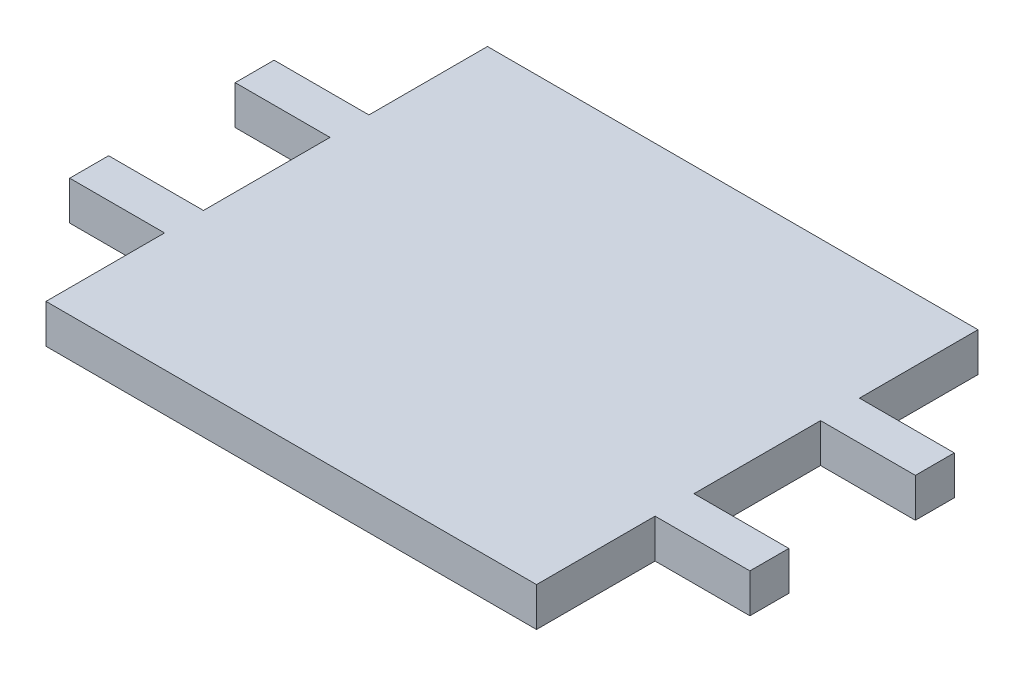
ISO-10303-21;
HEADER;
FILE_DESCRIPTION(('STEP AP214'),'2;1');
FILE_NAME('part.step','',(''),(''),'','','');
FILE_SCHEMA(('AUTOMOTIVE_DESIGN { 1 0 10303 214 1 1 1 1 }'));
ENDSEC;
DATA;
#1=APPLICATION_CONTEXT('core data for automotive mechanical design processes');
#2=APPLICATION_PROTOCOL_DEFINITION('international standard','automotive_design',2000,#1);
#3=PRODUCT_CONTEXT('',#1,'mechanical');
#4=PRODUCT('Part','Part','',(#3));
#5=PRODUCT_RELATED_PRODUCT_CATEGORY('part','',(#4));
#6=PRODUCT_DEFINITION_FORMATION('','',#4);
#7=PRODUCT_DEFINITION_CONTEXT('part definition',#1,'design');
#8=PRODUCT_DEFINITION('design','',#6,#7);
#9=PRODUCT_DEFINITION_SHAPE('','',#8);
#10=(LENGTH_UNIT() NAMED_UNIT(*) SI_UNIT(.MILLI.,.METRE.));
#11=(NAMED_UNIT(*) PLANE_ANGLE_UNIT() SI_UNIT($,.RADIAN.));
#12=(NAMED_UNIT(*) SI_UNIT($,.STERADIAN.) SOLID_ANGLE_UNIT());
#13=UNCERTAINTY_MEASURE_WITH_UNIT(LENGTH_MEASURE(1.E-05),#10,'distance_accuracy_value','');
#14=(GEOMETRIC_REPRESENTATION_CONTEXT(3) GLOBAL_UNCERTAINTY_ASSIGNED_CONTEXT((#13)) GLOBAL_UNIT_ASSIGNED_CONTEXT((#10,
#11,#12)) REPRESENTATION_CONTEXT('',''));
#15=CARTESIAN_POINT('',(0.,0.,0.));
#16=DIRECTION('',(0.,0.,1.));
#17=DIRECTION('',(1.,0.,0.));
#18=AXIS2_PLACEMENT_3D('',#15,#16,#17);
#19=CARTESIAN_POINT('',(38.1,6.0452,0.));
#20=DIRECTION('',(1.,0.,0.));
#21=DIRECTION('',(0.,0.,-1.));
#22=AXIS2_PLACEMENT_3D('',#19,#20,#21);
#23=PLANE('',#22);
#24=DIRECTION('',(0.,0.,1.));
#25=VECTOR('',#24,1.);
#26=CARTESIAN_POINT('',(38.1,0.,0.));
#27=LINE('',#26,#25);
#28=CARTESIAN_POINT('',(38.1,0.,-34.29));
#29=VERTEX_POINT('',#28);
#30=CARTESIAN_POINT('',(38.1,0.,-15.875));
#31=VERTEX_POINT('',#30);
#32=EDGE_CURVE('E219',#29,#31,#27,.T.);
#33=ORIENTED_EDGE('',*,*,#32,.F.);
#34=DIRECTION('',(0.,-1.,0.));
#35=VECTOR('',#34,1.);
#36=CARTESIAN_POINT('',(38.1,6.0452,-34.29));
#37=LINE('',#36,#35);
#38=CARTESIAN_POINT('',(38.1,6.0452,-34.29));
#39=VERTEX_POINT('',#38);
#40=EDGE_CURVE('E11',#39,#29,#37,.T.);
#41=ORIENTED_EDGE('',*,*,#40,.F.);
#42=DIRECTION('',(0.,0.,1.));
#43=VECTOR('',#42,1.);
#44=CARTESIAN_POINT('',(38.1,6.0452,0.));
#45=LINE('',#44,#43);
#46=CARTESIAN_POINT('',(38.1,6.0452,-15.875));
#47=VERTEX_POINT('',#46);
#48=EDGE_CURVE('E279',#39,#47,#45,.T.);
#49=ORIENTED_EDGE('',*,*,#48,.T.);
#50=DIRECTION('',(0.,-1.,0.));
#51=VECTOR('',#50,1.);
#52=CARTESIAN_POINT('',(38.1,6.0452,-15.875));
#53=LINE('',#52,#51);
#54=EDGE_CURVE('E137',#47,#31,#53,.T.);
#55=ORIENTED_EDGE('',*,*,#54,.T.);
#56=EDGE_LOOP('',(#33,#41,#49,#55));
#57=FACE_BOUND('',#56,.T.);
#58=ADVANCED_FACE('F49',(#57),#23,.T.);
#59=CARTESIAN_POINT('',(0.,6.0452,-34.29));
#60=DIRECTION('',(0.,0.,-1.));
#61=DIRECTION('',(-1.,0.,0.));
#62=AXIS2_PLACEMENT_3D('',#59,#60,#61);
#63=PLANE('',#62);
#64=DIRECTION('',(1.,0.,0.));
#65=VECTOR('',#64,1.);
#66=CARTESIAN_POINT('',(0.,0.,-34.29));
#67=LINE('',#66,#65);
#68=CARTESIAN_POINT('',(-38.1,0.,-34.29));
#69=VERTEX_POINT('',#68);
#70=EDGE_CURVE('E223',#69,#29,#67,.T.);
#71=ORIENTED_EDGE('',*,*,#70,.F.);
#72=DIRECTION('',(0.,-1.,0.));
#73=VECTOR('',#72,1.);
#74=CARTESIAN_POINT('',(-38.1,6.0452,-34.29));
#75=LINE('',#74,#73);
#76=CARTESIAN_POINT('',(-38.1,6.0452,-34.29));
#77=VERTEX_POINT('',#76);
#78=EDGE_CURVE('E59',#77,#69,#75,.T.);
#79=ORIENTED_EDGE('',*,*,#78,.F.);
#80=DIRECTION('',(1.,0.,0.));
#81=VECTOR('',#80,1.);
#82=CARTESIAN_POINT('',(0.,6.0452,-34.29));
#83=LINE('',#82,#81);
#84=EDGE_CURVE('E347',#77,#39,#83,.T.);
#85=ORIENTED_EDGE('',*,*,#84,.T.);
#86=ORIENTED_EDGE('',*,*,#40,.T.);
#87=EDGE_LOOP('',(#71,#79,#85,#86));
#88=FACE_BOUND('',#87,.T.);
#89=ADVANCED_FACE('F51',(#88),#63,.T.);
#90=CARTESIAN_POINT('',(-38.1,6.0452,0.));
#91=DIRECTION('',(1.,0.,0.));
#92=DIRECTION('',(0.,0.,-1.));
#93=AXIS2_PLACEMENT_3D('',#90,#91,#92);
#94=PLANE('',#93);
#95=DIRECTION('',(0.,0.,1.));
#96=VECTOR('',#95,1.);
#97=CARTESIAN_POINT('',(-38.1,0.,0.));
#98=LINE('',#97,#96);
#99=CARTESIAN_POINT('',(-38.1,0.,-15.875));
#100=VERTEX_POINT('',#99);
#101=EDGE_CURVE('E229',#69,#100,#98,.T.);
#102=ORIENTED_EDGE('',*,*,#101,.T.);
#103=DIRECTION('',(0.,-1.,0.));
#104=VECTOR('',#103,1.);
#105=CARTESIAN_POINT('',(-38.1,6.0452,-15.875));
#106=LINE('',#105,#104);
#107=CARTESIAN_POINT('',(-38.1,6.0452,-15.875));
#108=VERTEX_POINT('',#107);
#109=EDGE_CURVE('E330',#108,#100,#106,.T.);
#110=ORIENTED_EDGE('',*,*,#109,.F.);
#111=DIRECTION('',(0.,0.,1.));
#112=VECTOR('',#111,1.);
#113=CARTESIAN_POINT('',(-38.1,6.0452,0.));
#114=LINE('',#113,#112);
#115=EDGE_CURVE('E338',#77,#108,#114,.T.);
#116=ORIENTED_EDGE('',*,*,#115,.F.);
#117=ORIENTED_EDGE('',*,*,#78,.T.);
#118=EDGE_LOOP('',(#102,#110,#116,#117));
#119=FACE_BOUND('',#118,.T.);
#120=ADVANCED_FACE('F336',(#119),#94,.F.);
#121=CARTESIAN_POINT('',(0.,6.0452,-15.875));
#122=DIRECTION('',(0.,0.,-1.));
#123=DIRECTION('',(-1.,0.,0.));
#124=AXIS2_PLACEMENT_3D('',#121,#122,#123);
#125=PLANE('',#124);
#126=DIRECTION('',(1.,0.,0.));
#127=VECTOR('',#126,1.);
#128=CARTESIAN_POINT('',(0.,0.,-15.875));
#129=LINE('',#128,#127);
#130=CARTESIAN_POINT('',(-52.832,0.,-15.875));
#131=VERTEX_POINT('',#130);
#132=EDGE_CURVE('E233',#131,#100,#129,.T.);
#133=ORIENTED_EDGE('',*,*,#132,.F.);
#134=DIRECTION('',(0.,-1.,0.));
#135=VECTOR('',#134,1.);
#136=CARTESIAN_POINT('',(-52.832,6.0452,-15.875));
#137=LINE('',#136,#135);
#138=CARTESIAN_POINT('',(-52.832,6.0452,-15.875));
#139=VERTEX_POINT('',#138);
#140=EDGE_CURVE('E327',#139,#131,#137,.T.);
#141=ORIENTED_EDGE('',*,*,#140,.F.);
#142=DIRECTION('',(1.,0.,0.));
#143=VECTOR('',#142,1.);
#144=CARTESIAN_POINT('',(0.,6.0452,-15.875));
#145=LINE('',#144,#143);
#146=EDGE_CURVE('E438',#139,#108,#145,.T.);
#147=ORIENTED_EDGE('',*,*,#146,.T.);
#148=ORIENTED_EDGE('',*,*,#109,.T.);
#149=EDGE_LOOP('',(#133,#141,#147,#148));
#150=FACE_BOUND('',#149,.T.);
#151=ADVANCED_FACE('F444',(#150),#125,.T.);
#152=CARTESIAN_POINT('',(-52.832,6.0452,0.));
#153=DIRECTION('',(1.,0.,0.));
#154=DIRECTION('',(0.,0.,-1.));
#155=AXIS2_PLACEMENT_3D('',#152,#153,#154);
#156=PLANE('',#155);
#157=DIRECTION('',(0.,0.,1.));
#158=VECTOR('',#157,1.);
#159=CARTESIAN_POINT('',(-52.832,0.,0.));
#160=LINE('',#159,#158);
#161=CARTESIAN_POINT('',(-52.832,0.,-9.8298));
#162=VERTEX_POINT('',#161);
#163=EDGE_CURVE('E239',#131,#162,#160,.T.);
#164=ORIENTED_EDGE('',*,*,#163,.T.);
#165=DIRECTION('',(0.,-1.,0.));
#166=VECTOR('',#165,1.);
#167=CARTESIAN_POINT('',(-52.832,6.0452,-9.8298));
#168=LINE('',#167,#166);
#169=CARTESIAN_POINT('',(-52.832,6.0452,-9.8298));
#170=VERTEX_POINT('',#169);
#171=EDGE_CURVE('E323',#170,#162,#168,.T.);
#172=ORIENTED_EDGE('',*,*,#171,.F.);
#173=DIRECTION('',(0.,0.,1.));
#174=VECTOR('',#173,1.);
#175=CARTESIAN_POINT('',(-52.832,6.0452,0.));
#176=LINE('',#175,#174);
#177=EDGE_CURVE('E435',#139,#170,#176,.T.);
#178=ORIENTED_EDGE('',*,*,#177,.F.);
#179=ORIENTED_EDGE('',*,*,#140,.T.);
#180=EDGE_LOOP('',(#164,#172,#178,#179));
#181=FACE_BOUND('',#180,.T.);
#182=ADVANCED_FACE('F448',(#181),#156,.F.);
#183=CARTESIAN_POINT('',(0.,6.0452,-9.8298));
#184=DIRECTION('',(0.,0.,-1.));
#185=DIRECTION('',(-1.,0.,0.));
#186=AXIS2_PLACEMENT_3D('',#183,#184,#185);
#187=PLANE('',#186);
#188=DIRECTION('',(1.,0.,0.));
#189=VECTOR('',#188,1.);
#190=CARTESIAN_POINT('',(0.,0.,-9.8298));
#191=LINE('',#190,#189);
#192=CARTESIAN_POINT('',(-38.1,0.,-9.8298));
#193=VERTEX_POINT('',#192);
#194=EDGE_CURVE('E242',#162,#193,#191,.T.);
#195=ORIENTED_EDGE('',*,*,#194,.T.);
#196=DIRECTION('',(0.,-1.,0.));
#197=VECTOR('',#196,1.);
#198=CARTESIAN_POINT('',(-38.1,6.0452,-9.8298));
#199=LINE('',#198,#197);
#200=CARTESIAN_POINT('',(-38.1,6.0452,-9.8298));
#201=VERTEX_POINT('',#200);
#202=EDGE_CURVE('E319',#201,#193,#199,.T.);
#203=ORIENTED_EDGE('',*,*,#202,.F.);
#204=DIRECTION('',(1.,0.,0.));
#205=VECTOR('',#204,1.);
#206=CARTESIAN_POINT('',(0.,6.0452,-9.8298));
#207=LINE('',#206,#205);
#208=EDGE_CURVE('E431',#170,#201,#207,.T.);
#209=ORIENTED_EDGE('',*,*,#208,.F.);
#210=ORIENTED_EDGE('',*,*,#171,.T.);
#211=EDGE_LOOP('',(#195,#203,#209,#210));
#212=FACE_BOUND('',#211,.T.);
#213=ADVANCED_FACE('F451',(#212),#187,.F.);
#214=CARTESIAN_POINT('',(-38.1,0.,9.8298));
#215=VERTEX_POINT('',#214);
#216=EDGE_CURVE('E235',#193,#215,#98,.T.);
#217=ORIENTED_EDGE('',*,*,#216,.T.);
#218=DIRECTION('',(0.,-1.,0.));
#219=VECTOR('',#218,1.);
#220=CARTESIAN_POINT('',(-38.1,6.0452,9.8298));
#221=LINE('',#220,#219);
#222=CARTESIAN_POINT('',(-38.1,6.0452,9.8298));
#223=VERTEX_POINT('',#222);
#224=EDGE_CURVE('E316',#223,#215,#221,.T.);
#225=ORIENTED_EDGE('',*,*,#224,.F.);
#226=EDGE_CURVE('E374',#201,#223,#114,.T.);
#227=ORIENTED_EDGE('',*,*,#226,.F.);
#228=ORIENTED_EDGE('',*,*,#202,.T.);
#229=EDGE_LOOP('',(#217,#225,#227,#228));
#230=FACE_BOUND('',#229,.T.);
#231=ADVANCED_FACE('F414',(#230),#94,.F.);
#232=CARTESIAN_POINT('',(0.,6.0452,9.8298));
#233=DIRECTION('',(0.,0.,-1.));
#234=DIRECTION('',(-1.,0.,0.));
#235=AXIS2_PLACEMENT_3D('',#232,#233,#234);
#236=PLANE('',#235);
#237=DIRECTION('',(1.,0.,0.));
#238=VECTOR('',#237,1.);
#239=CARTESIAN_POINT('',(0.,0.,9.8298));
#240=LINE('',#239,#238);
#241=CARTESIAN_POINT('',(-52.832,0.,9.8298));
#242=VERTEX_POINT('',#241);
#243=EDGE_CURVE('E245',#242,#215,#240,.T.);
#244=ORIENTED_EDGE('',*,*,#243,.F.);
#245=DIRECTION('',(0.,-1.,0.));
#246=VECTOR('',#245,1.);
#247=CARTESIAN_POINT('',(-52.832,6.0452,9.8298));
#248=LINE('',#247,#246);
#249=CARTESIAN_POINT('',(-52.832,6.0452,9.8298));
#250=VERTEX_POINT('',#249);
#251=EDGE_CURVE('E313',#250,#242,#248,.T.);
#252=ORIENTED_EDGE('',*,*,#251,.F.);
#253=DIRECTION('',(1.,0.,0.));
#254=VECTOR('',#253,1.);
#255=CARTESIAN_POINT('',(0.,6.0452,9.8298));
#256=LINE('',#255,#254);
#257=EDGE_CURVE('E425',#250,#223,#256,.T.);
#258=ORIENTED_EDGE('',*,*,#257,.T.);
#259=ORIENTED_EDGE('',*,*,#224,.T.);
#260=EDGE_LOOP('',(#244,#252,#258,#259));
#261=FACE_BOUND('',#260,.T.);
#262=ADVANCED_FACE('F422',(#261),#236,.T.);
#263=CARTESIAN_POINT('',(-52.832,6.0452,0.));
#264=DIRECTION('',(1.,0.,0.));
#265=DIRECTION('',(0.,0.,-1.));
#266=AXIS2_PLACEMENT_3D('',#263,#264,#265);
#267=PLANE('',#266);
#268=DIRECTION('',(0.,0.,1.));
#269=VECTOR('',#268,1.);
#270=CARTESIAN_POINT('',(-52.832,0.,0.));
#271=LINE('',#270,#269);
#272=CARTESIAN_POINT('',(-52.832,0.,15.875));
#273=VERTEX_POINT('',#272);
#274=EDGE_CURVE('E249',#242,#273,#271,.T.);
#275=ORIENTED_EDGE('',*,*,#274,.T.);
#276=DIRECTION('',(0.,-1.,0.));
#277=VECTOR('',#276,1.);
#278=CARTESIAN_POINT('',(-52.832,6.0452,15.875));
#279=LINE('',#278,#277);
#280=CARTESIAN_POINT('',(-52.832,6.0452,15.875));
#281=VERTEX_POINT('',#280);
#282=EDGE_CURVE('E309',#281,#273,#279,.T.);
#283=ORIENTED_EDGE('',*,*,#282,.F.);
#284=DIRECTION('',(0.,0.,1.));
#285=VECTOR('',#284,1.);
#286=CARTESIAN_POINT('',(-52.832,6.0452,0.));
#287=LINE('',#286,#285);
#288=EDGE_CURVE('E427',#250,#281,#287,.T.);
#289=ORIENTED_EDGE('',*,*,#288,.F.);
#290=ORIENTED_EDGE('',*,*,#251,.T.);
#291=EDGE_LOOP('',(#275,#283,#289,#290));
#292=FACE_BOUND('',#291,.T.);
#293=ADVANCED_FACE('F491',(#292),#267,.F.);
#294=CARTESIAN_POINT('',(0.,6.0452,15.875));
#295=DIRECTION('',(0.,0.,-1.));
#296=DIRECTION('',(-1.,0.,0.));
#297=AXIS2_PLACEMENT_3D('',#294,#295,#296);
#298=PLANE('',#297);
#299=DIRECTION('',(1.,0.,0.));
#300=VECTOR('',#299,1.);
#301=CARTESIAN_POINT('',(0.,0.,15.875));
#302=LINE('',#301,#300);
#303=CARTESIAN_POINT('',(-38.1,0.,15.875));
#304=VERTEX_POINT('',#303);
#305=EDGE_CURVE('E252',#273,#304,#302,.T.);
#306=ORIENTED_EDGE('',*,*,#305,.T.);
#307=DIRECTION('',(0.,-1.,0.));
#308=VECTOR('',#307,1.);
#309=CARTESIAN_POINT('',(-38.1,6.0452,15.875));
#310=LINE('',#309,#308);
#311=CARTESIAN_POINT('',(-38.1,6.0452,15.875));
#312=VERTEX_POINT('',#311);
#313=EDGE_CURVE('E305',#312,#304,#310,.T.);
#314=ORIENTED_EDGE('',*,*,#313,.F.);
#315=DIRECTION('',(1.,0.,0.));
#316=VECTOR('',#315,1.);
#317=CARTESIAN_POINT('',(0.,6.0452,15.875));
#318=LINE('',#317,#316);
#319=EDGE_CURVE('E372',#281,#312,#318,.T.);
#320=ORIENTED_EDGE('',*,*,#319,.F.);
#321=ORIENTED_EDGE('',*,*,#282,.T.);
#322=EDGE_LOOP('',(#306,#314,#320,#321));
#323=FACE_BOUND('',#322,.T.);
#324=ADVANCED_FACE('F488',(#323),#298,.F.);
#325=CARTESIAN_POINT('',(-38.1,0.,34.29));
#326=VERTEX_POINT('',#325);
#327=EDGE_CURVE('E234',#304,#326,#98,.T.);
#328=ORIENTED_EDGE('',*,*,#327,.T.);
#329=DIRECTION('',(0.,-1.,0.));
#330=VECTOR('',#329,1.);
#331=CARTESIAN_POINT('',(-38.1,6.0452,34.29));
#332=LINE('',#331,#330);
#333=CARTESIAN_POINT('',(-38.1,6.0452,34.29));
#334=VERTEX_POINT('',#333);
#335=EDGE_CURVE('E301',#334,#326,#332,.T.);
#336=ORIENTED_EDGE('',*,*,#335,.F.);
#337=EDGE_CURVE('E367',#312,#334,#114,.T.);
#338=ORIENTED_EDGE('',*,*,#337,.F.);
#339=ORIENTED_EDGE('',*,*,#313,.T.);
#340=EDGE_LOOP('',(#328,#336,#338,#339));
#341=FACE_BOUND('',#340,.T.);
#342=ADVANCED_FACE('F405',(#341),#94,.F.);
#343=CARTESIAN_POINT('',(0.,6.0452,34.29));
#344=DIRECTION('',(0.,0.,-1.));
#345=DIRECTION('',(-1.,0.,0.));
#346=AXIS2_PLACEMENT_3D('',#343,#344,#345);
#347=PLANE('',#346);
#348=DIRECTION('',(1.,0.,0.));
#349=VECTOR('',#348,1.);
#350=CARTESIAN_POINT('',(0.,0.,34.29));
#351=LINE('',#350,#349);
#352=CARTESIAN_POINT('',(38.1,0.,34.29));
#353=VERTEX_POINT('',#352);
#354=EDGE_CURVE('E255',#326,#353,#351,.T.);
#355=ORIENTED_EDGE('',*,*,#354,.T.);
#356=DIRECTION('',(0.,-1.,0.));
#357=VECTOR('',#356,1.);
#358=CARTESIAN_POINT('',(38.1,6.0452,34.29));
#359=LINE('',#358,#357);
#360=CARTESIAN_POINT('',(38.1,6.0452,34.29));
#361=VERTEX_POINT('',#360);
#362=EDGE_CURVE('E298',#361,#353,#359,.T.);
#363=ORIENTED_EDGE('',*,*,#362,.F.);
#364=DIRECTION('',(1.,0.,0.));
#365=VECTOR('',#364,1.);
#366=CARTESIAN_POINT('',(0.,6.0452,34.29));
#367=LINE('',#366,#365);
#368=EDGE_CURVE('E359',#334,#361,#367,.T.);
#369=ORIENTED_EDGE('',*,*,#368,.F.);
#370=ORIENTED_EDGE('',*,*,#335,.T.);
#371=EDGE_LOOP('',(#355,#363,#369,#370));
#372=FACE_BOUND('',#371,.T.);
#373=ADVANCED_FACE('F401',(#372),#347,.F.);
#374=CARTESIAN_POINT('',(38.1,0.,15.875));
#375=VERTEX_POINT('',#374);
#376=EDGE_CURVE('E225',#375,#353,#27,.T.);
#377=ORIENTED_EDGE('',*,*,#376,.F.);
#378=DIRECTION('',(0.,-1.,0.));
#379=VECTOR('',#378,1.);
#380=CARTESIAN_POINT('',(38.1,6.0452,15.875));
#381=LINE('',#380,#379);
#382=CARTESIAN_POINT('',(38.1,6.0452,15.875));
#383=VERTEX_POINT('',#382);
#384=EDGE_CURVE('E295',#383,#375,#381,.T.);
#385=ORIENTED_EDGE('',*,*,#384,.F.);
#386=EDGE_CURVE('E351',#383,#361,#45,.T.);
#387=ORIENTED_EDGE('',*,*,#386,.T.);
#388=ORIENTED_EDGE('',*,*,#362,.T.);
#389=EDGE_LOOP('',(#377,#385,#387,#388));
#390=FACE_BOUND('',#389,.T.);
#391=ADVANCED_FACE('F399',(#390),#23,.T.);
#392=CARTESIAN_POINT('',(0.,6.0452,15.875));
#393=DIRECTION('',(0.,0.,1.));
#394=DIRECTION('',(1.,0.,0.));
#395=AXIS2_PLACEMENT_3D('',#392,#393,#394);
#396=PLANE('',#395);
#397=DIRECTION('',(-1.,0.,0.));
#398=VECTOR('',#397,1.);
#399=CARTESIAN_POINT('',(0.,0.,15.875));
#400=LINE('',#399,#398);
#401=CARTESIAN_POINT('',(52.832,0.,15.875));
#402=VERTEX_POINT('',#401);
#403=EDGE_CURVE('E259',#402,#375,#400,.T.);
#404=ORIENTED_EDGE('',*,*,#403,.F.);
#405=DIRECTION('',(0.,-1.,0.));
#406=VECTOR('',#405,1.);
#407=CARTESIAN_POINT('',(52.832,6.0452,15.875));
#408=LINE('',#407,#406);
#409=CARTESIAN_POINT('',(52.832,6.0452,15.875));
#410=VERTEX_POINT('',#409);
#411=EDGE_CURVE('E292',#410,#402,#408,.T.);
#412=ORIENTED_EDGE('',*,*,#411,.F.);
#413=DIRECTION('',(-1.,0.,0.));
#414=VECTOR('',#413,1.);
#415=CARTESIAN_POINT('',(0.,6.0452,15.875));
#416=LINE('',#415,#414);
#417=EDGE_CURVE('E358',#410,#383,#416,.T.);
#418=ORIENTED_EDGE('',*,*,#417,.T.);
#419=ORIENTED_EDGE('',*,*,#384,.T.);
#420=EDGE_LOOP('',(#404,#412,#418,#419));
#421=FACE_BOUND('',#420,.T.);
#422=ADVANCED_FACE('F469',(#421),#396,.T.);
#423=CARTESIAN_POINT('',(52.832,6.0452,0.));
#424=DIRECTION('',(1.,0.,0.));
#425=DIRECTION('',(0.,0.,-1.));
#426=AXIS2_PLACEMENT_3D('',#423,#424,#425);
#427=PLANE('',#426);
#428=DIRECTION('',(0.,0.,1.));
#429=VECTOR('',#428,1.);
#430=CARTESIAN_POINT('',(52.832,0.,0.));
#431=LINE('',#430,#429);
#432=CARTESIAN_POINT('',(52.832,0.,9.82979999999999));
#433=VERTEX_POINT('',#432);
#434=EDGE_CURVE('E263',#433,#402,#431,.T.);
#435=ORIENTED_EDGE('',*,*,#434,.F.);
#436=DIRECTION('',(0.,-1.,0.));
#437=VECTOR('',#436,1.);
#438=CARTESIAN_POINT('',(52.832,6.0452,9.82979999999999));
#439=LINE('',#438,#437);
#440=CARTESIAN_POINT('',(52.832,6.0452,9.82979999999999));
#441=VERTEX_POINT('',#440);
#442=EDGE_CURVE('E289',#441,#433,#439,.T.);
#443=ORIENTED_EDGE('',*,*,#442,.F.);
#444=DIRECTION('',(0.,0.,1.));
#445=VECTOR('',#444,1.);
#446=CARTESIAN_POINT('',(52.832,6.0452,0.));
#447=LINE('',#446,#445);
#448=EDGE_CURVE('E365',#441,#410,#447,.T.);
#449=ORIENTED_EDGE('',*,*,#448,.T.);
#450=ORIENTED_EDGE('',*,*,#411,.T.);
#451=EDGE_LOOP('',(#435,#443,#449,#450));
#452=FACE_BOUND('',#451,.T.);
#453=ADVANCED_FACE('F475',(#452),#427,.T.);
#454=CARTESIAN_POINT('',(0.,6.0452,9.8298));
#455=DIRECTION('',(0.,0.,1.));
#456=DIRECTION('',(1.,0.,0.));
#457=AXIS2_PLACEMENT_3D('',#454,#455,#456);
#458=PLANE('',#457);
#459=DIRECTION('',(-1.,0.,0.));
#460=VECTOR('',#459,1.);
#461=CARTESIAN_POINT('',(0.,0.,9.8298));
#462=LINE('',#461,#460);
#463=CARTESIAN_POINT('',(38.1,0.,9.82979999999999));
#464=VERTEX_POINT('',#463);
#465=EDGE_CURVE('E267',#433,#464,#462,.T.);
#466=ORIENTED_EDGE('',*,*,#465,.T.);
#467=DIRECTION('',(0.,-1.,0.));
#468=VECTOR('',#467,1.);
#469=CARTESIAN_POINT('',(38.1,6.0452,9.82979999999999));
#470=LINE('',#469,#468);
#471=CARTESIAN_POINT('',(38.1,6.0452,9.82979999999999));
#472=VERTEX_POINT('',#471);
#473=EDGE_CURVE('E286',#472,#464,#470,.T.);
#474=ORIENTED_EDGE('',*,*,#473,.F.);
#475=DIRECTION('',(-1.,0.,0.));
#476=VECTOR('',#475,1.);
#477=CARTESIAN_POINT('',(0.,6.0452,9.8298));
#478=LINE('',#477,#476);
#479=EDGE_CURVE('E355',#441,#472,#478,.T.);
#480=ORIENTED_EDGE('',*,*,#479,.F.);
#481=ORIENTED_EDGE('',*,*,#442,.T.);
#482=EDGE_LOOP('',(#466,#474,#480,#481));
#483=FACE_BOUND('',#482,.T.);
#484=ADVANCED_FACE('F386',(#483),#458,.F.);
#485=CARTESIAN_POINT('',(38.1,0.,-9.82980000000001));
#486=VERTEX_POINT('',#485);
#487=EDGE_CURVE('E224',#486,#464,#27,.T.);
#488=ORIENTED_EDGE('',*,*,#487,.F.);
#489=DIRECTION('',(0.,-1.,0.));
#490=VECTOR('',#489,1.);
#491=CARTESIAN_POINT('',(38.1,6.0452,-9.82980000000001));
#492=LINE('',#491,#490);
#493=CARTESIAN_POINT('',(38.1,6.0452,-9.82980000000001));
#494=VERTEX_POINT('',#493);
#495=EDGE_CURVE('E203',#494,#486,#492,.T.);
#496=ORIENTED_EDGE('',*,*,#495,.F.);
#497=EDGE_CURVE('E209',#494,#472,#45,.T.);
#498=ORIENTED_EDGE('',*,*,#497,.T.);
#499=ORIENTED_EDGE('',*,*,#473,.T.);
#500=EDGE_LOOP('',(#488,#496,#498,#499));
#501=FACE_BOUND('',#500,.T.);
#502=ADVANCED_FACE('F391',(#501),#23,.T.);
#503=CARTESIAN_POINT('',(0.,6.0452,-9.8298));
#504=DIRECTION('',(0.,0.,1.));
#505=DIRECTION('',(1.,0.,0.));
#506=AXIS2_PLACEMENT_3D('',#503,#504,#505);
#507=PLANE('',#506);
#508=DIRECTION('',(-1.,0.,0.));
#509=VECTOR('',#508,1.);
#510=CARTESIAN_POINT('',(0.,0.,-9.8298));
#511=LINE('',#510,#509);
#512=CARTESIAN_POINT('',(52.832,0.,-9.82980000000001));
#513=VERTEX_POINT('',#512);
#514=EDGE_CURVE('E197',#513,#486,#511,.T.);
#515=ORIENTED_EDGE('',*,*,#514,.F.);
#516=DIRECTION('',(0.,-1.,0.));
#517=VECTOR('',#516,1.);
#518=CARTESIAN_POINT('',(52.832,6.0452,-9.82980000000001));
#519=LINE('',#518,#517);
#520=CARTESIAN_POINT('',(52.832,6.0452,-9.82980000000001));
#521=VERTEX_POINT('',#520);
#522=EDGE_CURVE('E192',#521,#513,#519,.T.);
#523=ORIENTED_EDGE('',*,*,#522,.F.);
#524=DIRECTION('',(-1.,0.,0.));
#525=VECTOR('',#524,1.);
#526=CARTESIAN_POINT('',(0.,6.0452,-9.8298));
#527=LINE('',#526,#525);
#528=EDGE_CURVE('E195',#521,#494,#527,.T.);
#529=ORIENTED_EDGE('',*,*,#528,.T.);
#530=ORIENTED_EDGE('',*,*,#495,.T.);
#531=EDGE_LOOP('',(#515,#523,#529,#530));
#532=FACE_BOUND('',#531,.T.);
#533=ADVANCED_FACE('F194',(#532),#507,.T.);
#534=CARTESIAN_POINT('',(52.832,6.0452,0.));
#535=DIRECTION('',(1.,0.,0.));
#536=DIRECTION('',(0.,0.,-1.));
#537=AXIS2_PLACEMENT_3D('',#534,#535,#536);
#538=PLANE('',#537);
#539=DIRECTION('',(0.,0.,1.));
#540=VECTOR('',#539,1.);
#541=CARTESIAN_POINT('',(52.832,0.,0.));
#542=LINE('',#541,#540);
#543=CARTESIAN_POINT('',(52.832,0.,-15.875));
#544=VERTEX_POINT('',#543);
#545=EDGE_CURVE('E273',#544,#513,#542,.T.);
#546=ORIENTED_EDGE('',*,*,#545,.F.);
#547=DIRECTION('',(0.,-1.,0.));
#548=VECTOR('',#547,1.);
#549=CARTESIAN_POINT('',(52.832,6.0452,-15.875));
#550=LINE('',#549,#548);
#551=CARTESIAN_POINT('',(52.832,6.0452,-15.875));
#552=VERTEX_POINT('',#551);
#553=EDGE_CURVE('E130',#552,#544,#550,.T.);
#554=ORIENTED_EDGE('',*,*,#553,.F.);
#555=DIRECTION('',(0.,0.,1.));
#556=VECTOR('',#555,1.);
#557=CARTESIAN_POINT('',(52.832,6.0452,0.));
#558=LINE('',#557,#556);
#559=EDGE_CURVE('E207',#552,#521,#558,.T.);
#560=ORIENTED_EDGE('',*,*,#559,.T.);
#561=ORIENTED_EDGE('',*,*,#522,.T.);
#562=EDGE_LOOP('',(#546,#554,#560,#561));
#563=FACE_BOUND('',#562,.T.);
#564=ADVANCED_FACE('F212',(#563),#538,.T.);
#565=CARTESIAN_POINT('',(0.,6.0452,-15.875));
#566=DIRECTION('',(0.,0.,1.));
#567=DIRECTION('',(1.,0.,0.));
#568=AXIS2_PLACEMENT_3D('',#565,#566,#567);
#569=PLANE('',#568);
#570=DIRECTION('',(-1.,0.,0.));
#571=VECTOR('',#570,1.);
#572=CARTESIAN_POINT('',(0.,0.,-15.875));
#573=LINE('',#572,#571);
#574=EDGE_CURVE('E276',#544,#31,#573,.T.);
#575=ORIENTED_EDGE('',*,*,#574,.T.);
#576=ORIENTED_EDGE('',*,*,#54,.F.);
#577=DIRECTION('',(-1.,0.,0.));
#578=VECTOR('',#577,1.);
#579=CARTESIAN_POINT('',(0.,6.0452,-15.875));
#580=LINE('',#579,#578);
#581=EDGE_CURVE('E67',#552,#47,#580,.T.);
#582=ORIENTED_EDGE('',*,*,#581,.F.);
#583=ORIENTED_EDGE('',*,*,#553,.T.);
#584=EDGE_LOOP('',(#575,#576,#582,#583));
#585=FACE_BOUND('',#584,.T.);
#586=ADVANCED_FACE('F348',(#585),#569,.F.);
#587=CARTESIAN_POINT('',(0.,6.0452,0.));
#588=DIRECTION('',(0.,1.,0.));
#589=DIRECTION('',(0.,0.,1.));
#590=AXIS2_PLACEMENT_3D('',#587,#588,#589);
#591=PLANE('',#590);
#592=ORIENTED_EDGE('',*,*,#48,.F.);
#593=ORIENTED_EDGE('',*,*,#84,.F.);
#594=ORIENTED_EDGE('',*,*,#115,.T.);
#595=ORIENTED_EDGE('',*,*,#146,.F.);
#596=ORIENTED_EDGE('',*,*,#177,.T.);
#597=ORIENTED_EDGE('',*,*,#208,.T.);
#598=ORIENTED_EDGE('',*,*,#226,.T.);
#599=ORIENTED_EDGE('',*,*,#257,.F.);
#600=ORIENTED_EDGE('',*,*,#288,.T.);
#601=ORIENTED_EDGE('',*,*,#319,.T.);
#602=ORIENTED_EDGE('',*,*,#337,.T.);
#603=ORIENTED_EDGE('',*,*,#368,.T.);
#604=ORIENTED_EDGE('',*,*,#386,.F.);
#605=ORIENTED_EDGE('',*,*,#417,.F.);
#606=ORIENTED_EDGE('',*,*,#448,.F.);
#607=ORIENTED_EDGE('',*,*,#479,.T.);
#608=ORIENTED_EDGE('',*,*,#497,.F.);
#609=ORIENTED_EDGE('',*,*,#528,.F.);
#610=ORIENTED_EDGE('',*,*,#559,.F.);
#611=ORIENTED_EDGE('',*,*,#581,.T.);
#612=EDGE_LOOP('',(#592,#593,#594,#595,#596,#597,#598,#599,#600,#601,#602,#603,#604,#605,#606,
#607,#608,#609,#610,#611));
#613=FACE_BOUND('',#612,.T.);
#614=ADVANCED_FACE('F206',(#613),#591,.T.);
#615=CARTESIAN_POINT('',(0.,0.,0.));
#616=DIRECTION('',(0.,1.,0.));
#617=DIRECTION('',(0.,0.,1.));
#618=AXIS2_PLACEMENT_3D('',#615,#616,#617);
#619=PLANE('',#618);
#620=ORIENTED_EDGE('',*,*,#32,.T.);
#621=ORIENTED_EDGE('',*,*,#574,.F.);
#622=ORIENTED_EDGE('',*,*,#545,.T.);
#623=ORIENTED_EDGE('',*,*,#514,.T.);
#624=ORIENTED_EDGE('',*,*,#487,.T.);
#625=ORIENTED_EDGE('',*,*,#465,.F.);
#626=ORIENTED_EDGE('',*,*,#434,.T.);
#627=ORIENTED_EDGE('',*,*,#403,.T.);
#628=ORIENTED_EDGE('',*,*,#376,.T.);
#629=ORIENTED_EDGE('',*,*,#354,.F.);
#630=ORIENTED_EDGE('',*,*,#327,.F.);
#631=ORIENTED_EDGE('',*,*,#305,.F.);
#632=ORIENTED_EDGE('',*,*,#274,.F.);
#633=ORIENTED_EDGE('',*,*,#243,.T.);
#634=ORIENTED_EDGE('',*,*,#216,.F.);
#635=ORIENTED_EDGE('',*,*,#194,.F.);
#636=ORIENTED_EDGE('',*,*,#163,.F.);
#637=ORIENTED_EDGE('',*,*,#132,.T.);
#638=ORIENTED_EDGE('',*,*,#101,.F.);
#639=ORIENTED_EDGE('',*,*,#70,.T.);
#640=EDGE_LOOP('',(#620,#621,#622,#623,#624,#625,#626,#627,#628,#629,#630,#631,#632,#633,#634,
#635,#636,#637,#638,#639));
#641=FACE_BOUND('',#640,.T.);
#642=ADVANCED_FACE('F344',(#641),#619,.F.);
#643=CLOSED_SHELL('',(#58,#89,#120,#151,#182,#213,#231,#262,#293,#324,#342,#373,#391,#422,#453,
#484,#502,#533,#564,#586,#614,#642));
#644=MANIFOLD_SOLID_BREP('B2',#643);
#645=ADVANCED_BREP_SHAPE_REPRESENTATION('',(#18,#644),#14);
#646=SHAPE_DEFINITION_REPRESENTATION(#9,#645);
ENDSEC;
END-ISO-10303-21;
